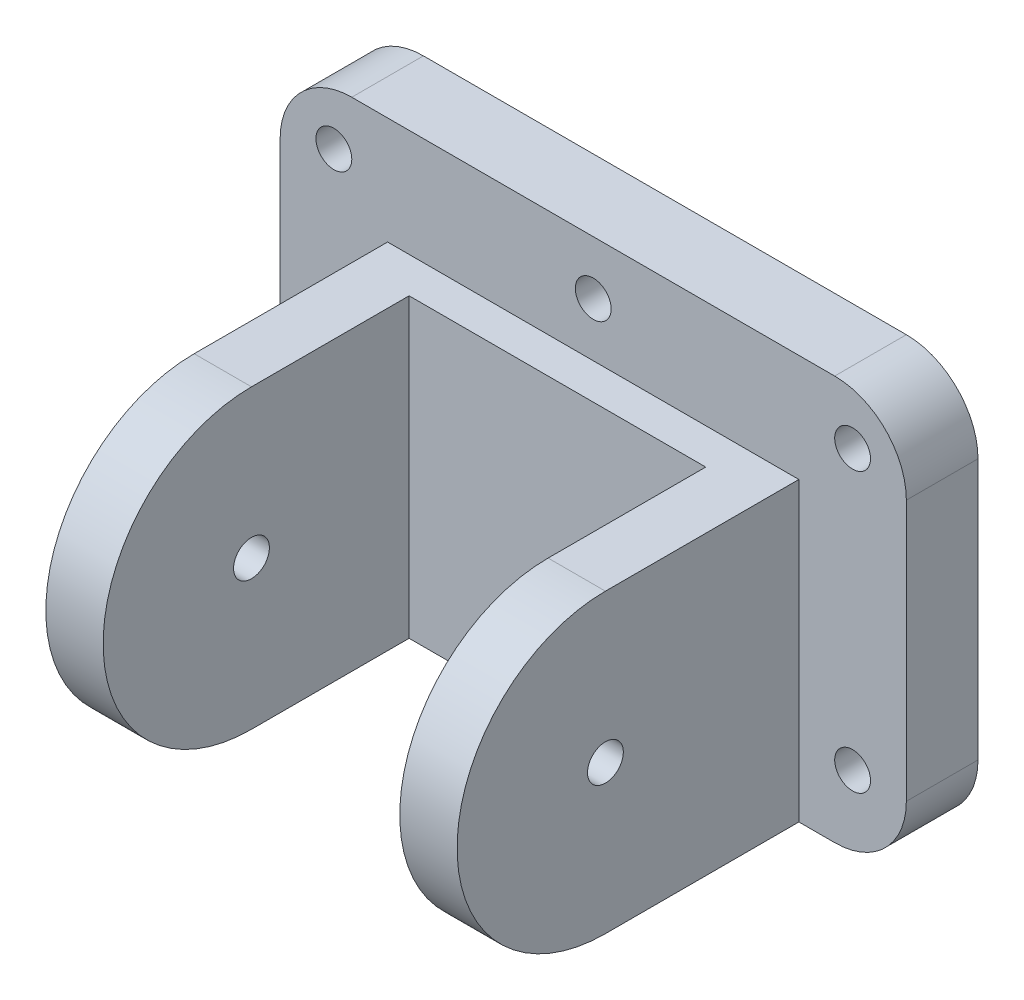
ISO-10303-21;
HEADER;
FILE_DESCRIPTION(('STEP AP214'),'2;1');
FILE_NAME('part.step','',(''),(''),'','','');
FILE_SCHEMA(('AUTOMOTIVE_DESIGN { 1 0 10303 214 1 1 1 1 }'));
ENDSEC;
DATA;
#1=APPLICATION_CONTEXT('core data for automotive mechanical design processes');
#2=APPLICATION_PROTOCOL_DEFINITION('international standard','automotive_design',2000,#1);
#3=PRODUCT_CONTEXT('',#1,'mechanical');
#4=PRODUCT('Part','Part','',(#3));
#5=PRODUCT_RELATED_PRODUCT_CATEGORY('part','',(#4));
#6=PRODUCT_DEFINITION_FORMATION('','',#4);
#7=PRODUCT_DEFINITION_CONTEXT('part definition',#1,'design');
#8=PRODUCT_DEFINITION('design','',#6,#7);
#9=PRODUCT_DEFINITION_SHAPE('','',#8);
#10=(LENGTH_UNIT() NAMED_UNIT(*) SI_UNIT(.MILLI.,.METRE.));
#11=(NAMED_UNIT(*) PLANE_ANGLE_UNIT() SI_UNIT($,.RADIAN.));
#12=(NAMED_UNIT(*) SI_UNIT($,.STERADIAN.) SOLID_ANGLE_UNIT());
#13=UNCERTAINTY_MEASURE_WITH_UNIT(LENGTH_MEASURE(1.E-05),#10,'distance_accuracy_value','');
#14=(GEOMETRIC_REPRESENTATION_CONTEXT(3) GLOBAL_UNCERTAINTY_ASSIGNED_CONTEXT((#13)) GLOBAL_UNIT_ASSIGNED_CONTEXT((#10,
#11,#12)) REPRESENTATION_CONTEXT('',''));
#15=CARTESIAN_POINT('',(0.,0.,0.));
#16=DIRECTION('',(0.,0.,1.));
#17=DIRECTION('',(1.,0.,0.));
#18=AXIS2_PLACEMENT_3D('',#15,#16,#17);
#19=CARTESIAN_POINT('',(-28.7,20.7,10.));
#20=DIRECTION('',(0.,-1.,0.));
#21=DIRECTION('',(0.,0.,-1.));
#22=AXIS2_PLACEMENT_3D('',#19,#20,#21);
#23=PLANE('',#22);
#24=DIRECTION('',(1.,0.,0.));
#25=VECTOR('',#24,1.);
#26=CARTESIAN_POINT('',(-43.7,20.7,10.));
#27=LINE('',#26,#25);
#28=CARTESIAN_POINT('',(-28.7,20.7,10.));
#29=VERTEX_POINT('',#28);
#30=CARTESIAN_POINT('',(28.7,20.7,10.));
#31=VERTEX_POINT('',#30);
#32=EDGE_CURVE('E147',#29,#31,#27,.T.);
#33=ORIENTED_EDGE('',*,*,#32,.F.);
#34=DIRECTION('',(0.,0.,-1.));
#35=VECTOR('',#34,1.);
#36=CARTESIAN_POINT('',(-28.7,20.7,10.));
#37=LINE('',#36,#35);
#38=CARTESIAN_POINT('',(-28.7,20.7,37.));
#39=VERTEX_POINT('',#38);
#40=EDGE_CURVE('E149',#39,#29,#37,.T.);
#41=ORIENTED_EDGE('',*,*,#40,.F.);
#42=DIRECTION('',(-1.,0.,0.));
#43=VECTOR('',#42,1.);
#44=CARTESIAN_POINT('',(-20.7,20.7,37.));
#45=LINE('',#44,#43);
#46=CARTESIAN_POINT('',(-20.7,20.7,37.));
#47=VERTEX_POINT('',#46);
#48=EDGE_CURVE('E208',#47,#39,#45,.T.);
#49=ORIENTED_EDGE('',*,*,#48,.F.);
#50=DIRECTION('',(0.,0.,-1.));
#51=VECTOR('',#50,1.);
#52=CARTESIAN_POINT('',(-20.7,20.7,15.));
#53=LINE('',#52,#51);
#54=CARTESIAN_POINT('',(-20.7,20.7,15.));
#55=VERTEX_POINT('',#54);
#56=EDGE_CURVE('E194',#47,#55,#53,.T.);
#57=ORIENTED_EDGE('',*,*,#56,.T.);
#58=DIRECTION('',(-1.,0.,0.));
#59=VECTOR('',#58,1.);
#60=CARTESIAN_POINT('',(-28.7,20.7,15.));
#61=LINE('',#60,#59);
#62=CARTESIAN_POINT('',(20.7,20.7,15.));
#63=VERTEX_POINT('',#62);
#64=EDGE_CURVE('E231',#63,#55,#61,.T.);
#65=ORIENTED_EDGE('',*,*,#64,.F.);
#66=DIRECTION('',(0.,0.,1.));
#67=VECTOR('',#66,1.);
#68=CARTESIAN_POINT('',(20.7,20.7,15.));
#69=LINE('',#68,#67);
#70=CARTESIAN_POINT('',(20.7,20.7,37.));
#71=VERTEX_POINT('',#70);
#72=EDGE_CURVE('E219',#63,#71,#69,.T.);
#73=ORIENTED_EDGE('',*,*,#72,.T.);
#74=DIRECTION('',(1.,0.,0.));
#75=VECTOR('',#74,1.);
#76=CARTESIAN_POINT('',(20.7,20.7,37.));
#77=LINE('',#76,#75);
#78=CARTESIAN_POINT('',(28.7,20.7,37.));
#79=VERTEX_POINT('',#78);
#80=EDGE_CURVE('E225',#71,#79,#77,.T.);
#81=ORIENTED_EDGE('',*,*,#80,.T.);
#82=DIRECTION('',(0.,0.,-1.));
#83=VECTOR('',#82,1.);
#84=CARTESIAN_POINT('',(28.7,20.7,10.));
#85=LINE('',#84,#83);
#86=EDGE_CURVE('E152',#79,#31,#85,.T.);
#87=ORIENTED_EDGE('',*,*,#86,.T.);
#88=EDGE_LOOP('',(#33,#41,#49,#57,#65,#73,#81,#87));
#89=FACE_BOUND('',#88,.T.);
#90=ADVANCED_FACE('F33',(#89),#23,.F.);
#91=CARTESIAN_POINT('',(28.7,20.7,10.));
#92=DIRECTION('',(-1.,0.,0.));
#93=DIRECTION('',(0.,0.,1.));
#94=AXIS2_PLACEMENT_3D('',#91,#92,#93);
#95=PLANE('',#94);
#96=CARTESIAN_POINT('',(28.7,0.,37.));
#97=DIRECTION('',(1.,0.,0.));
#98=DIRECTION('',(0.,0.,-1.));
#99=AXIS2_PLACEMENT_3D('',#96,#97,#98);
#100=CIRCLE('',#99,2.5);
#101=CARTESIAN_POINT('',(28.7,0.,34.5));
#102=VERTEX_POINT('',#101);
#103=EDGE_CURVE('E184',#102,#102,#100,.T.);
#104=ORIENTED_EDGE('',*,*,#103,.F.);
#105=EDGE_LOOP('',(#104));
#106=FACE_BOUND('',#105,.T.);
#107=DIRECTION('',(0.,-1.,0.));
#108=VECTOR('',#107,1.);
#109=CARTESIAN_POINT('',(28.7,20.7,10.));
#110=LINE('',#109,#108);
#111=CARTESIAN_POINT('',(28.7,-20.7,9.99999999999999));
#112=VERTEX_POINT('',#111);
#113=EDGE_CURVE('E289',#31,#112,#110,.T.);
#114=ORIENTED_EDGE('',*,*,#113,.F.);
#115=ORIENTED_EDGE('',*,*,#86,.F.);
#116=CARTESIAN_POINT('',(28.7,0.,37.));
#117=DIRECTION('',(1.,0.,0.));
#118=DIRECTION('',(0.,0.,1.));
#119=AXIS2_PLACEMENT_3D('',#116,#117,#118);
#120=CIRCLE('',#119,20.7);
#121=CARTESIAN_POINT('',(28.7,-20.7,37.));
#122=VERTEX_POINT('',#121);
#123=EDGE_CURVE('E210',#79,#122,#120,.T.);
#124=ORIENTED_EDGE('',*,*,#123,.T.);
#125=DIRECTION('',(0.,0.,-1.));
#126=VECTOR('',#125,1.);
#127=CARTESIAN_POINT('',(28.7,-20.7,10.));
#128=LINE('',#127,#126);
#129=EDGE_CURVE('E239',#122,#112,#128,.T.);
#130=ORIENTED_EDGE('',*,*,#129,.T.);
#131=EDGE_LOOP('',(#114,#115,#124,#130));
#132=FACE_BOUND('',#131,.T.);
#133=ADVANCED_FACE('F322',(#106,#132),#95,.F.);
#134=CARTESIAN_POINT('',(-28.7,20.7,10.));
#135=DIRECTION('',(1.,0.,0.));
#136=DIRECTION('',(0.,0.,-1.));
#137=AXIS2_PLACEMENT_3D('',#134,#135,#136);
#138=PLANE('',#137);
#139=CARTESIAN_POINT('',(-28.7,0.,37.));
#140=DIRECTION('',(1.,0.,0.));
#141=DIRECTION('',(0.,0.,-1.));
#142=AXIS2_PLACEMENT_3D('',#139,#140,#141);
#143=CIRCLE('',#142,2.5);
#144=CARTESIAN_POINT('',(-28.7,0.,34.5));
#145=VERTEX_POINT('',#144);
#146=EDGE_CURVE('E187',#145,#145,#143,.F.);
#147=ORIENTED_EDGE('',*,*,#146,.F.);
#148=EDGE_LOOP('',(#147));
#149=FACE_BOUND('',#148,.T.);
#150=DIRECTION('',(0.,1.,0.));
#151=VECTOR('',#150,1.);
#152=CARTESIAN_POINT('',(-28.7,20.7,10.));
#153=LINE('',#152,#151);
#154=CARTESIAN_POINT('',(-28.7,-20.7,10.));
#155=VERTEX_POINT('',#154);
#156=EDGE_CURVE('E163',#155,#29,#153,.T.);
#157=ORIENTED_EDGE('',*,*,#156,.F.);
#158=DIRECTION('',(0.,0.,-1.));
#159=VECTOR('',#158,1.);
#160=CARTESIAN_POINT('',(-28.7,-20.7,10.));
#161=LINE('',#160,#159);
#162=CARTESIAN_POINT('',(-28.7,-20.7,37.));
#163=VERTEX_POINT('',#162);
#164=EDGE_CURVE('E167',#163,#155,#161,.T.);
#165=ORIENTED_EDGE('',*,*,#164,.F.);
#166=CARTESIAN_POINT('',(-28.7,0.,37.));
#167=DIRECTION('',(-1.,0.,0.));
#168=DIRECTION('',(0.,0.,-1.));
#169=AXIS2_PLACEMENT_3D('',#166,#167,#168);
#170=CIRCLE('',#169,20.7);
#171=EDGE_CURVE('E166',#163,#39,#170,.T.);
#172=ORIENTED_EDGE('',*,*,#171,.T.);
#173=ORIENTED_EDGE('',*,*,#40,.T.);
#174=EDGE_LOOP('',(#157,#165,#172,#173));
#175=FACE_BOUND('',#174,.T.);
#176=ADVANCED_FACE('F162',(#149,#175),#138,.F.);
#177=CARTESIAN_POINT('',(0.,0.,15.));
#178=DIRECTION('',(0.,0.,1.));
#179=DIRECTION('',(1.,0.,0.));
#180=AXIS2_PLACEMENT_3D('',#177,#178,#179);
#181=PLANE('',#180);
#182=DIRECTION('',(0.,-1.,0.));
#183=VECTOR('',#182,1.);
#184=CARTESIAN_POINT('',(-20.7,20.7,15.));
#185=LINE('',#184,#183);
#186=CARTESIAN_POINT('',(-20.7,-20.7,15.));
#187=VERTEX_POINT('',#186);
#188=EDGE_CURVE('E197',#55,#187,#185,.T.);
#189=ORIENTED_EDGE('',*,*,#188,.T.);
#190=DIRECTION('',(1.,0.,0.));
#191=VECTOR('',#190,1.);
#192=CARTESIAN_POINT('',(-28.7,-20.7,15.));
#193=LINE('',#192,#191);
#194=CARTESIAN_POINT('',(20.7,-20.7,15.));
#195=VERTEX_POINT('',#194);
#196=EDGE_CURVE('E234',#187,#195,#193,.T.);
#197=ORIENTED_EDGE('',*,*,#196,.T.);
#198=DIRECTION('',(0.,1.,0.));
#199=VECTOR('',#198,1.);
#200=CARTESIAN_POINT('',(20.7,-20.7,15.));
#201=LINE('',#200,#199);
#202=EDGE_CURVE('E216',#195,#63,#201,.T.);
#203=ORIENTED_EDGE('',*,*,#202,.T.);
#204=ORIENTED_EDGE('',*,*,#64,.T.);
#205=EDGE_LOOP('',(#189,#197,#203,#204));
#206=FACE_BOUND('',#205,.T.);
#207=ADVANCED_FACE('F465',(#206),#181,.T.);
#208=CARTESIAN_POINT('',(-28.7,-20.7,10.));
#209=DIRECTION('',(0.,1.,0.));
#210=DIRECTION('',(0.,0.,1.));
#211=AXIS2_PLACEMENT_3D('',#208,#209,#210);
#212=PLANE('',#211);
#213=DIRECTION('',(1.,0.,0.));
#214=VECTOR('',#213,1.);
#215=CARTESIAN_POINT('',(-28.7,-20.7,0.));
#216=LINE('',#215,#214);
#217=CARTESIAN_POINT('',(-33.7,-20.7,0.));
#218=VERTEX_POINT('',#217);
#219=CARTESIAN_POINT('',(33.7,-20.7,0.));
#220=VERTEX_POINT('',#219);
#221=EDGE_CURVE('E236',#218,#220,#216,.T.);
#222=ORIENTED_EDGE('',*,*,#221,.T.);
#223=DIRECTION('',(0.,0.,-1.));
#224=VECTOR('',#223,1.);
#225=CARTESIAN_POINT('',(33.7,-20.7,10.));
#226=LINE('',#225,#224);
#227=CARTESIAN_POINT('',(33.7,-20.7,9.99999999999999));
#228=VERTEX_POINT('',#227);
#229=EDGE_CURVE('E261',#220,#228,#226,.F.);
#230=ORIENTED_EDGE('',*,*,#229,.T.);
#231=DIRECTION('',(-1.,0.,0.));
#232=VECTOR('',#231,1.);
#233=CARTESIAN_POINT('',(43.7,-20.7,9.99999999999999));
#234=LINE('',#233,#232);
#235=EDGE_CURVE('E174',#228,#112,#234,.T.);
#236=ORIENTED_EDGE('',*,*,#235,.T.);
#237=ORIENTED_EDGE('',*,*,#129,.F.);
#238=DIRECTION('',(1.,0.,0.));
#239=VECTOR('',#238,1.);
#240=CARTESIAN_POINT('',(20.7,-20.7,37.));
#241=LINE('',#240,#239);
#242=CARTESIAN_POINT('',(20.7,-20.7,37.));
#243=VERTEX_POINT('',#242);
#244=EDGE_CURVE('E228',#243,#122,#241,.T.);
#245=ORIENTED_EDGE('',*,*,#244,.F.);
#246=DIRECTION('',(0.,0.,-1.));
#247=VECTOR('',#246,1.);
#248=CARTESIAN_POINT('',(20.7,-20.7,15.));
#249=LINE('',#248,#247);
#250=EDGE_CURVE('E213',#243,#195,#249,.T.);
#251=ORIENTED_EDGE('',*,*,#250,.T.);
#252=ORIENTED_EDGE('',*,*,#196,.F.);
#253=DIRECTION('',(0.,0.,1.));
#254=VECTOR('',#253,1.);
#255=CARTESIAN_POINT('',(-20.7,-20.7,15.));
#256=LINE('',#255,#254);
#257=CARTESIAN_POINT('',(-20.7,-20.7,37.));
#258=VERTEX_POINT('',#257);
#259=EDGE_CURVE('E200',#187,#258,#256,.T.);
#260=ORIENTED_EDGE('',*,*,#259,.T.);
#261=DIRECTION('',(-1.,0.,0.));
#262=VECTOR('',#261,1.);
#263=CARTESIAN_POINT('',(-20.7,-20.7,37.));
#264=LINE('',#263,#262);
#265=EDGE_CURVE('E206',#258,#163,#264,.T.);
#266=ORIENTED_EDGE('',*,*,#265,.T.);
#267=ORIENTED_EDGE('',*,*,#164,.T.);
#268=DIRECTION('',(1.,0.,0.));
#269=VECTOR('',#268,1.);
#270=CARTESIAN_POINT('',(-43.7,-20.7,10.));
#271=LINE('',#270,#269);
#272=CARTESIAN_POINT('',(-33.7,-20.7,10.));
#273=VERTEX_POINT('',#272);
#274=EDGE_CURVE('E172',#273,#155,#271,.T.);
#275=ORIENTED_EDGE('',*,*,#274,.F.);
#276=DIRECTION('',(0.,0.,1.));
#277=VECTOR('',#276,1.);
#278=CARTESIAN_POINT('',(-33.7,-20.7,0.));
#279=LINE('',#278,#277);
#280=EDGE_CURVE('E259',#273,#218,#279,.F.);
#281=ORIENTED_EDGE('',*,*,#280,.T.);
#282=EDGE_LOOP('',(#222,#230,#236,#237,#245,#251,#252,#260,#266,#267,#275,#281));
#283=FACE_BOUND('',#282,.T.);
#284=ADVANCED_FACE('F310',(#283),#212,.F.);
#285=CARTESIAN_POINT('',(0.,0.,0.));
#286=DIRECTION('',(0.,0.,1.));
#287=DIRECTION('',(1.,0.,0.));
#288=AXIS2_PLACEMENT_3D('',#285,#286,#287);
#289=PLANE('',#288);
#290=CARTESIAN_POINT('',(-36.2,28.2,0.));
#291=DIRECTION('',(0.,0.,1.));
#292=DIRECTION('',(1.,0.,0.));
#293=AXIS2_PLACEMENT_3D('',#290,#291,#292);
#294=CIRCLE('',#293,2.5);
#295=CARTESIAN_POINT('',(-33.7,28.2,0.));
#296=VERTEX_POINT('',#295);
#297=EDGE_CURVE('E627',#296,#296,#294,.F.);
#298=ORIENTED_EDGE('',*,*,#297,.F.);
#299=EDGE_LOOP('',(#298));
#300=FACE_BOUND('',#299,.T.);
#301=CARTESIAN_POINT('',(36.2,28.2,0.));
#302=DIRECTION('',(0.,0.,1.));
#303=DIRECTION('',(1.,0.,0.));
#304=AXIS2_PLACEMENT_3D('',#301,#302,#303);
#305=CIRCLE('',#304,2.5);
#306=CARTESIAN_POINT('',(38.7,28.2,0.));
#307=VERTEX_POINT('',#306);
#308=EDGE_CURVE('E631',#307,#307,#305,.F.);
#309=ORIENTED_EDGE('',*,*,#308,.F.);
#310=EDGE_LOOP('',(#309));
#311=FACE_BOUND('',#310,.T.);
#312=CARTESIAN_POINT('',(36.2,-10.7,0.));
#313=DIRECTION('',(0.,0.,1.));
#314=DIRECTION('',(1.,0.,0.));
#315=AXIS2_PLACEMENT_3D('',#312,#313,#314);
#316=CIRCLE('',#315,2.5);
#317=CARTESIAN_POINT('',(38.7,-10.7,0.));
#318=VERTEX_POINT('',#317);
#319=EDGE_CURVE('E635',#318,#318,#316,.F.);
#320=ORIENTED_EDGE('',*,*,#319,.F.);
#321=EDGE_LOOP('',(#320));
#322=FACE_BOUND('',#321,.T.);
#323=CARTESIAN_POINT('',(0.,28.2,0.));
#324=DIRECTION('',(0.,0.,1.));
#325=DIRECTION('',(1.,0.,0.));
#326=AXIS2_PLACEMENT_3D('',#323,#324,#325);
#327=CIRCLE('',#326,2.5);
#328=CARTESIAN_POINT('',(2.5,28.2,0.));
#329=VERTEX_POINT('',#328);
#330=EDGE_CURVE('E639',#329,#329,#327,.F.);
#331=ORIENTED_EDGE('',*,*,#330,.F.);
#332=EDGE_LOOP('',(#331));
#333=FACE_BOUND('',#332,.T.);
#334=CARTESIAN_POINT('',(-36.2,-10.7,0.));
#335=DIRECTION('',(0.,0.,1.));
#336=DIRECTION('',(1.,0.,0.));
#337=AXIS2_PLACEMENT_3D('',#334,#335,#336);
#338=CIRCLE('',#337,2.5);
#339=CARTESIAN_POINT('',(-33.7,-10.7,0.));
#340=VERTEX_POINT('',#339);
#341=EDGE_CURVE('E157',#340,#340,#338,.F.);
#342=ORIENTED_EDGE('',*,*,#341,.F.);
#343=EDGE_LOOP('',(#342));
#344=FACE_BOUND('',#343,.T.);
#345=DIRECTION('',(0.,1.,0.));
#346=VECTOR('',#345,1.);
#347=CARTESIAN_POINT('',(43.7,20.7,0.));
#348=LINE('',#347,#346);
#349=CARTESIAN_POINT('',(43.7,-10.7,0.));
#350=VERTEX_POINT('',#349);
#351=CARTESIAN_POINT('',(43.7,25.7,0.));
#352=VERTEX_POINT('',#351);
#353=EDGE_CURVE('E291',#350,#352,#348,.T.);
#354=ORIENTED_EDGE('',*,*,#353,.F.);
#355=CARTESIAN_POINT('',(33.7,-10.7,0.));
#356=DIRECTION('',(0.,0.,1.));
#357=DIRECTION('',(1.,0.,0.));
#358=AXIS2_PLACEMENT_3D('',#355,#356,#357);
#359=CIRCLE('',#358,10.);
#360=EDGE_CURVE('E257',#350,#220,#359,.F.);
#361=ORIENTED_EDGE('',*,*,#360,.T.);
#362=ORIENTED_EDGE('',*,*,#221,.F.);
#363=CARTESIAN_POINT('',(-33.7,-10.7,0.));
#364=DIRECTION('',(0.,0.,1.));
#365=DIRECTION('',(1.,0.,0.));
#366=AXIS2_PLACEMENT_3D('',#363,#364,#365);
#367=CIRCLE('',#366,10.);
#368=CARTESIAN_POINT('',(-43.7,-10.7,0.));
#369=VERTEX_POINT('',#368);
#370=EDGE_CURVE('E255',#218,#369,#367,.F.);
#371=ORIENTED_EDGE('',*,*,#370,.T.);
#372=DIRECTION('',(0.,-1.,0.));
#373=VECTOR('',#372,1.);
#374=CARTESIAN_POINT('',(-43.7,20.7,0.));
#375=LINE('',#374,#373);
#376=CARTESIAN_POINT('',(-43.7,25.7,0.));
#377=VERTEX_POINT('',#376);
#378=EDGE_CURVE('E173',#377,#369,#375,.T.);
#379=ORIENTED_EDGE('',*,*,#378,.F.);
#380=CARTESIAN_POINT('',(-33.7,25.7,0.));
#381=DIRECTION('',(0.,0.,1.));
#382=DIRECTION('',(1.,0.,0.));
#383=AXIS2_PLACEMENT_3D('',#380,#381,#382);
#384=CIRCLE('',#383,10.);
#385=CARTESIAN_POINT('',(-33.7,35.7,0.));
#386=VERTEX_POINT('',#385);
#387=EDGE_CURVE('E253',#377,#386,#384,.F.);
#388=ORIENTED_EDGE('',*,*,#387,.T.);
#389=DIRECTION('',(-1.,0.,0.));
#390=VECTOR('',#389,1.);
#391=CARTESIAN_POINT('',(-43.7,35.7,0.));
#392=LINE('',#391,#390);
#393=CARTESIAN_POINT('',(33.7,35.7,0.));
#394=VERTEX_POINT('',#393);
#395=EDGE_CURVE('E279',#394,#386,#392,.T.);
#396=ORIENTED_EDGE('',*,*,#395,.F.);
#397=CARTESIAN_POINT('',(33.7,25.7,0.));
#398=DIRECTION('',(0.,0.,1.));
#399=DIRECTION('',(1.,0.,0.));
#400=AXIS2_PLACEMENT_3D('',#397,#398,#399);
#401=CIRCLE('',#400,10.);
#402=EDGE_CURVE('E251',#394,#352,#401,.F.);
#403=ORIENTED_EDGE('',*,*,#402,.T.);
#404=EDGE_LOOP('',(#354,#361,#362,#371,#379,#388,#396,#403));
#405=FACE_BOUND('',#404,.T.);
#406=ADVANCED_FACE('F285',(#300,#311,#322,#333,#344,#405),#289,.F.);
#407=CARTESIAN_POINT('',(20.7,0.,37.));
#408=DIRECTION('',(1.,0.,0.));
#409=DIRECTION('',(0.,0.,-1.));
#410=AXIS2_PLACEMENT_3D('',#407,#408,#409);
#411=CYLINDRICAL_SURFACE('',#410,20.7);
#412=ORIENTED_EDGE('',*,*,#123,.F.);
#413=ORIENTED_EDGE('',*,*,#80,.F.);
#414=CARTESIAN_POINT('',(20.7,0.,37.));
#415=DIRECTION('',(1.,0.,0.));
#416=DIRECTION('',(0.,0.,1.));
#417=AXIS2_PLACEMENT_3D('',#414,#415,#416);
#418=CIRCLE('',#417,20.7);
#419=EDGE_CURVE('E222',#71,#243,#418,.T.);
#420=ORIENTED_EDGE('',*,*,#419,.T.);
#421=ORIENTED_EDGE('',*,*,#244,.T.);
#422=EDGE_LOOP('',(#412,#413,#420,#421));
#423=FACE_BOUND('',#422,.T.);
#424=ADVANCED_FACE('F453',(#423),#411,.T.);
#425=CARTESIAN_POINT('',(20.7,0.,37.));
#426=DIRECTION('',(-1.,0.,0.));
#427=DIRECTION('',(0.,0.,1.));
#428=AXIS2_PLACEMENT_3D('',#425,#426,#427);
#429=PLANE('',#428);
#430=CARTESIAN_POINT('',(20.7,0.,37.));
#431=DIRECTION('',(-1.,0.,0.));
#432=DIRECTION('',(0.,0.,1.));
#433=AXIS2_PLACEMENT_3D('',#430,#431,#432);
#434=CIRCLE('',#433,2.5);
#435=CARTESIAN_POINT('',(20.7,0.,39.5));
#436=VERTEX_POINT('',#435);
#437=EDGE_CURVE('E191',#436,#436,#434,.T.);
#438=ORIENTED_EDGE('',*,*,#437,.F.);
#439=EDGE_LOOP('',(#438));
#440=FACE_BOUND('',#439,.T.);
#441=ORIENTED_EDGE('',*,*,#250,.F.);
#442=ORIENTED_EDGE('',*,*,#419,.F.);
#443=ORIENTED_EDGE('',*,*,#72,.F.);
#444=ORIENTED_EDGE('',*,*,#202,.F.);
#445=EDGE_LOOP('',(#441,#442,#443,#444));
#446=FACE_BOUND('',#445,.T.);
#447=ADVANCED_FACE('F528',(#440,#446),#429,.T.);
#448=CARTESIAN_POINT('',(-20.7,0.,37.));
#449=DIRECTION('',(-1.,0.,0.));
#450=DIRECTION('',(0.,0.,1.));
#451=AXIS2_PLACEMENT_3D('',#448,#449,#450);
#452=CYLINDRICAL_SURFACE('',#451,20.7);
#453=ORIENTED_EDGE('',*,*,#171,.F.);
#454=ORIENTED_EDGE('',*,*,#265,.F.);
#455=CARTESIAN_POINT('',(-20.7,0.,37.));
#456=DIRECTION('',(-1.,0.,0.));
#457=DIRECTION('',(0.,0.,-1.));
#458=AXIS2_PLACEMENT_3D('',#455,#456,#457);
#459=CIRCLE('',#458,20.7);
#460=EDGE_CURVE('E203',#258,#47,#459,.T.);
#461=ORIENTED_EDGE('',*,*,#460,.T.);
#462=ORIENTED_EDGE('',*,*,#48,.T.);
#463=EDGE_LOOP('',(#453,#454,#461,#462));
#464=FACE_BOUND('',#463,.T.);
#465=ADVANCED_FACE('F520',(#464),#452,.T.);
#466=CARTESIAN_POINT('',(-20.7,0.,37.));
#467=DIRECTION('',(1.,0.,0.));
#468=DIRECTION('',(0.,0.,-1.));
#469=AXIS2_PLACEMENT_3D('',#466,#467,#468);
#470=PLANE('',#469);
#471=CARTESIAN_POINT('',(-20.7,0.,37.));
#472=DIRECTION('',(1.,0.,0.));
#473=DIRECTION('',(0.,0.,-1.));
#474=AXIS2_PLACEMENT_3D('',#471,#472,#473);
#475=CIRCLE('',#474,2.5);
#476=CARTESIAN_POINT('',(-20.7,0.,34.5));
#477=VERTEX_POINT('',#476);
#478=EDGE_CURVE('E190',#477,#477,#475,.T.);
#479=ORIENTED_EDGE('',*,*,#478,.F.);
#480=EDGE_LOOP('',(#479));
#481=FACE_BOUND('',#480,.T.);
#482=ORIENTED_EDGE('',*,*,#56,.F.);
#483=ORIENTED_EDGE('',*,*,#460,.F.);
#484=ORIENTED_EDGE('',*,*,#259,.F.);
#485=ORIENTED_EDGE('',*,*,#188,.F.);
#486=EDGE_LOOP('',(#482,#483,#484,#485));
#487=FACE_BOUND('',#486,.T.);
#488=ADVANCED_FACE('F511',(#481,#487),#470,.T.);
#489=CARTESIAN_POINT('',(-35.7710678118655,0.,37.));
#490=DIRECTION('',(1.,0.,0.));
#491=DIRECTION('',(0.,0.,-1.));
#492=AXIS2_PLACEMENT_3D('',#489,#490,#491);
#493=CYLINDRICAL_SURFACE('',#492,2.5);
#494=ORIENTED_EDGE('',*,*,#478,.T.);
#495=EDGE_LOOP('',(#494));
#496=FACE_BOUND('',#495,.T.);
#497=ORIENTED_EDGE('',*,*,#146,.T.);
#498=EDGE_LOOP('',(#497));
#499=FACE_BOUND('',#498,.T.);
#500=ADVANCED_FACE('F500',(#496,#499),#493,.F.);
#501=ORIENTED_EDGE('',*,*,#437,.T.);
#502=EDGE_LOOP('',(#501));
#503=FACE_BOUND('',#502,.T.);
#504=ORIENTED_EDGE('',*,*,#103,.T.);
#505=EDGE_LOOP('',(#504));
#506=FACE_BOUND('',#505,.T.);
#507=ADVANCED_FACE('F442',(#503,#506),#493,.F.);
#508=CARTESIAN_POINT('',(-43.7,20.7,10.));
#509=DIRECTION('',(0.,0.,-1.));
#510=DIRECTION('',(0.,1.,0.));
#511=AXIS2_PLACEMENT_3D('',#508,#509,#510);
#512=PLANE('',#511);
#513=CARTESIAN_POINT('',(-36.2,28.2,10.));
#514=DIRECTION('',(0.,0.,1.));
#515=DIRECTION('',(1.,0.,0.));
#516=AXIS2_PLACEMENT_3D('',#513,#514,#515);
#517=CIRCLE('',#516,2.5);
#518=CARTESIAN_POINT('',(-33.7,28.2,10.));
#519=VERTEX_POINT('',#518);
#520=EDGE_CURVE('E647',#519,#519,#517,.T.);
#521=ORIENTED_EDGE('',*,*,#520,.F.);
#522=EDGE_LOOP('',(#521));
#523=FACE_BOUND('',#522,.T.);
#524=CARTESIAN_POINT('',(36.2,28.2,10.));
#525=DIRECTION('',(0.,0.,1.));
#526=DIRECTION('',(1.,0.,0.));
#527=AXIS2_PLACEMENT_3D('',#524,#525,#526);
#528=CIRCLE('',#527,2.5);
#529=CARTESIAN_POINT('',(38.7,28.2,10.));
#530=VERTEX_POINT('',#529);
#531=EDGE_CURVE('E648',#530,#530,#528,.T.);
#532=ORIENTED_EDGE('',*,*,#531,.F.);
#533=EDGE_LOOP('',(#532));
#534=FACE_BOUND('',#533,.T.);
#535=CARTESIAN_POINT('',(36.2,-10.7,10.));
#536=DIRECTION('',(0.,0.,1.));
#537=DIRECTION('',(1.,0.,0.));
#538=AXIS2_PLACEMENT_3D('',#535,#536,#537);
#539=CIRCLE('',#538,2.5);
#540=CARTESIAN_POINT('',(38.7,-10.7,10.));
#541=VERTEX_POINT('',#540);
#542=EDGE_CURVE('E655',#541,#541,#539,.T.);
#543=ORIENTED_EDGE('',*,*,#542,.F.);
#544=EDGE_LOOP('',(#543));
#545=FACE_BOUND('',#544,.T.);
#546=CARTESIAN_POINT('',(0.,28.2,10.));
#547=DIRECTION('',(0.,0.,1.));
#548=DIRECTION('',(1.,0.,0.));
#549=AXIS2_PLACEMENT_3D('',#546,#547,#548);
#550=CIRCLE('',#549,2.5);
#551=CARTESIAN_POINT('',(2.5,28.2,10.));
#552=VERTEX_POINT('',#551);
#553=EDGE_CURVE('E656',#552,#552,#550,.T.);
#554=ORIENTED_EDGE('',*,*,#553,.F.);
#555=EDGE_LOOP('',(#554));
#556=FACE_BOUND('',#555,.T.);
#557=CARTESIAN_POINT('',(-36.2,-10.7,10.));
#558=DIRECTION('',(0.,0.,1.));
#559=DIRECTION('',(1.,0.,0.));
#560=AXIS2_PLACEMENT_3D('',#557,#558,#559);
#561=CIRCLE('',#560,2.5);
#562=CARTESIAN_POINT('',(-33.7,-10.7,10.));
#563=VERTEX_POINT('',#562);
#564=EDGE_CURVE('E642',#563,#563,#561,.T.);
#565=ORIENTED_EDGE('',*,*,#564,.F.);
#566=EDGE_LOOP('',(#565));
#567=FACE_BOUND('',#566,.T.);
#568=ORIENTED_EDGE('',*,*,#235,.F.);
#569=CARTESIAN_POINT('',(33.7,-10.7,10.));
#570=DIRECTION('',(0.,0.,-1.));
#571=DIRECTION('',(0.,1.,0.));
#572=AXIS2_PLACEMENT_3D('',#569,#570,#571);
#573=CIRCLE('',#572,10.);
#574=CARTESIAN_POINT('',(43.7,-10.7,10.));
#575=VERTEX_POINT('',#574);
#576=EDGE_CURVE('E267',#228,#575,#573,.F.);
#577=ORIENTED_EDGE('',*,*,#576,.T.);
#578=DIRECTION('',(0.,-1.,0.));
#579=VECTOR('',#578,1.);
#580=CARTESIAN_POINT('',(43.7,20.7,10.));
#581=LINE('',#580,#579);
#582=CARTESIAN_POINT('',(43.7,25.7,10.));
#583=VERTEX_POINT('',#582);
#584=EDGE_CURVE('E179',#583,#575,#581,.T.);
#585=ORIENTED_EDGE('',*,*,#584,.F.);
#586=CARTESIAN_POINT('',(33.7,25.7,10.));
#587=DIRECTION('',(0.,0.,-1.));
#588=DIRECTION('',(0.,1.,0.));
#589=AXIS2_PLACEMENT_3D('',#586,#587,#588);
#590=CIRCLE('',#589,10.);
#591=CARTESIAN_POINT('',(33.7,35.7,10.));
#592=VERTEX_POINT('',#591);
#593=EDGE_CURVE('E263',#583,#592,#590,.F.);
#594=ORIENTED_EDGE('',*,*,#593,.T.);
#595=DIRECTION('',(1.,0.,0.));
#596=VECTOR('',#595,1.);
#597=CARTESIAN_POINT('',(-43.7,35.7,10.));
#598=LINE('',#597,#596);
#599=CARTESIAN_POINT('',(-33.7,35.7,10.));
#600=VERTEX_POINT('',#599);
#601=EDGE_CURVE('E156',#600,#592,#598,.T.);
#602=ORIENTED_EDGE('',*,*,#601,.F.);
#603=CARTESIAN_POINT('',(-33.7,25.7,10.));
#604=DIRECTION('',(0.,0.,-1.));
#605=DIRECTION('',(0.,1.,0.));
#606=AXIS2_PLACEMENT_3D('',#603,#604,#605);
#607=CIRCLE('',#606,10.);
#608=CARTESIAN_POINT('',(-43.7,25.7,10.));
#609=VERTEX_POINT('',#608);
#610=EDGE_CURVE('E48',#600,#609,#607,.F.);
#611=ORIENTED_EDGE('',*,*,#610,.T.);
#612=DIRECTION('',(0.,1.,0.));
#613=VECTOR('',#612,1.);
#614=CARTESIAN_POINT('',(-43.7,20.7,10.));
#615=LINE('',#614,#613);
#616=CARTESIAN_POINT('',(-43.7,-10.7,10.));
#617=VERTEX_POINT('',#616);
#618=EDGE_CURVE('E177',#617,#609,#615,.T.);
#619=ORIENTED_EDGE('',*,*,#618,.F.);
#620=CARTESIAN_POINT('',(-33.7,-10.7,10.));
#621=DIRECTION('',(0.,0.,-1.));
#622=DIRECTION('',(0.,1.,0.));
#623=AXIS2_PLACEMENT_3D('',#620,#621,#622);
#624=CIRCLE('',#623,10.);
#625=EDGE_CURVE('E56',#617,#273,#624,.F.);
#626=ORIENTED_EDGE('',*,*,#625,.T.);
#627=ORIENTED_EDGE('',*,*,#274,.T.);
#628=ORIENTED_EDGE('',*,*,#156,.T.);
#629=ORIENTED_EDGE('',*,*,#32,.T.);
#630=ORIENTED_EDGE('',*,*,#113,.T.);
#631=EDGE_LOOP('',(#568,#577,#585,#594,#602,#611,#619,#626,#627,#628,#629,#630));
#632=FACE_BOUND('',#631,.T.);
#633=ADVANCED_FACE('F170',(#523,#534,#545,#556,#567,#632),#512,.F.);
#634=CARTESIAN_POINT('',(-43.7,0.,0.));
#635=DIRECTION('',(-1.,0.,0.));
#636=DIRECTION('',(0.,0.,1.));
#637=AXIS2_PLACEMENT_3D('',#634,#635,#636);
#638=PLANE('',#637);
#639=ORIENTED_EDGE('',*,*,#378,.T.);
#640=DIRECTION('',(0.,0.,1.));
#641=VECTOR('',#640,1.);
#642=CARTESIAN_POINT('',(-43.7,-10.7,10.));
#643=LINE('',#642,#641);
#644=EDGE_CURVE('E271',#369,#617,#643,.T.);
#645=ORIENTED_EDGE('',*,*,#644,.T.);
#646=ORIENTED_EDGE('',*,*,#618,.T.);
#647=DIRECTION('',(0.,0.,1.));
#648=VECTOR('',#647,1.);
#649=CARTESIAN_POINT('',(-43.7,25.7,0.));
#650=LINE('',#649,#648);
#651=EDGE_CURVE('E269',#609,#377,#650,.F.);
#652=ORIENTED_EDGE('',*,*,#651,.T.);
#653=EDGE_LOOP('',(#639,#645,#646,#652));
#654=FACE_BOUND('',#653,.T.);
#655=ADVANCED_FACE('F313',(#654),#638,.T.);
#656=CARTESIAN_POINT('',(43.7,0.,0.));
#657=DIRECTION('',(-1.,0.,0.));
#658=DIRECTION('',(0.,0.,1.));
#659=AXIS2_PLACEMENT_3D('',#656,#657,#658);
#660=PLANE('',#659);
#661=ORIENTED_EDGE('',*,*,#584,.T.);
#662=DIRECTION('',(0.,0.,-1.));
#663=VECTOR('',#662,1.);
#664=CARTESIAN_POINT('',(43.7,-10.7,0.));
#665=LINE('',#664,#663);
#666=EDGE_CURVE('E248',#575,#350,#665,.T.);
#667=ORIENTED_EDGE('',*,*,#666,.T.);
#668=ORIENTED_EDGE('',*,*,#353,.T.);
#669=DIRECTION('',(0.,0.,-1.));
#670=VECTOR('',#669,1.);
#671=CARTESIAN_POINT('',(43.7,25.7,10.));
#672=LINE('',#671,#670);
#673=EDGE_CURVE('E244',#352,#583,#672,.F.);
#674=ORIENTED_EDGE('',*,*,#673,.T.);
#675=EDGE_LOOP('',(#661,#667,#668,#674));
#676=FACE_BOUND('',#675,.T.);
#677=ADVANCED_FACE('F301',(#676),#660,.F.);
#678=CARTESIAN_POINT('',(0.,35.7,0.));
#679=DIRECTION('',(0.,1.,0.));
#680=DIRECTION('',(0.,0.,1.));
#681=AXIS2_PLACEMENT_3D('',#678,#679,#680);
#682=PLANE('',#681);
#683=ORIENTED_EDGE('',*,*,#395,.T.);
#684=DIRECTION('',(0.,0.,1.));
#685=VECTOR('',#684,1.);
#686=CARTESIAN_POINT('',(-33.7,35.7,0.));
#687=LINE('',#686,#685);
#688=EDGE_CURVE('E11',#386,#600,#687,.T.);
#689=ORIENTED_EDGE('',*,*,#688,.T.);
#690=ORIENTED_EDGE('',*,*,#601,.T.);
#691=DIRECTION('',(0.,0.,-1.));
#692=VECTOR('',#691,1.);
#693=CARTESIAN_POINT('',(33.7,35.7,0.));
#694=LINE('',#693,#692);
#695=EDGE_CURVE('E41',#592,#394,#694,.T.);
#696=ORIENTED_EDGE('',*,*,#695,.T.);
#697=EDGE_LOOP('',(#683,#689,#690,#696));
#698=FACE_BOUND('',#697,.T.);
#699=ADVANCED_FACE('F278',(#698),#682,.T.);
#700=CARTESIAN_POINT('',(-36.2,-10.7,-7.07106781186548));
#701=DIRECTION('',(0.,0.,1.));
#702=DIRECTION('',(1.,0.,0.));
#703=AXIS2_PLACEMENT_3D('',#700,#701,#702);
#704=CYLINDRICAL_SURFACE('',#703,2.5);
#705=ORIENTED_EDGE('',*,*,#341,.T.);
#706=EDGE_LOOP('',(#705));
#707=FACE_BOUND('',#706,.T.);
#708=ORIENTED_EDGE('',*,*,#564,.T.);
#709=EDGE_LOOP('',(#708));
#710=FACE_BOUND('',#709,.T.);
#711=ADVANCED_FACE('F393',(#707,#710),#704,.F.);
#712=CARTESIAN_POINT('',(0.,28.2,-7.07106781186548));
#713=DIRECTION('',(0.,0.,1.));
#714=DIRECTION('',(1.,0.,0.));
#715=AXIS2_PLACEMENT_3D('',#712,#713,#714);
#716=CYLINDRICAL_SURFACE('',#715,2.5);
#717=ORIENTED_EDGE('',*,*,#330,.T.);
#718=EDGE_LOOP('',(#717));
#719=FACE_BOUND('',#718,.T.);
#720=ORIENTED_EDGE('',*,*,#553,.T.);
#721=EDGE_LOOP('',(#720));
#722=FACE_BOUND('',#721,.T.);
#723=ADVANCED_FACE('F384',(#719,#722),#716,.F.);
#724=CARTESIAN_POINT('',(36.2,-10.7,-7.07106781186548));
#725=DIRECTION('',(0.,0.,1.));
#726=DIRECTION('',(1.,0.,0.));
#727=AXIS2_PLACEMENT_3D('',#724,#725,#726);
#728=CYLINDRICAL_SURFACE('',#727,2.5);
#729=ORIENTED_EDGE('',*,*,#319,.T.);
#730=EDGE_LOOP('',(#729));
#731=FACE_BOUND('',#730,.T.);
#732=ORIENTED_EDGE('',*,*,#542,.T.);
#733=EDGE_LOOP('',(#732));
#734=FACE_BOUND('',#733,.T.);
#735=ADVANCED_FACE('F375',(#731,#734),#728,.F.);
#736=CARTESIAN_POINT('',(36.2,28.2,-7.07106781186548));
#737=DIRECTION('',(0.,0.,1.));
#738=DIRECTION('',(1.,0.,0.));
#739=AXIS2_PLACEMENT_3D('',#736,#737,#738);
#740=CYLINDRICAL_SURFACE('',#739,2.5);
#741=ORIENTED_EDGE('',*,*,#308,.T.);
#742=EDGE_LOOP('',(#741));
#743=FACE_BOUND('',#742,.T.);
#744=ORIENTED_EDGE('',*,*,#531,.T.);
#745=EDGE_LOOP('',(#744));
#746=FACE_BOUND('',#745,.T.);
#747=ADVANCED_FACE('F365',(#743,#746),#740,.F.);
#748=CARTESIAN_POINT('',(-36.2,28.2,-7.07106781186548));
#749=DIRECTION('',(0.,0.,1.));
#750=DIRECTION('',(1.,0.,0.));
#751=AXIS2_PLACEMENT_3D('',#748,#749,#750);
#752=CYLINDRICAL_SURFACE('',#751,2.5);
#753=ORIENTED_EDGE('',*,*,#297,.T.);
#754=EDGE_LOOP('',(#753));
#755=FACE_BOUND('',#754,.T.);
#756=ORIENTED_EDGE('',*,*,#520,.T.);
#757=EDGE_LOOP('',(#756));
#758=FACE_BOUND('',#757,.T.);
#759=ADVANCED_FACE('F334',(#755,#758),#752,.F.);
#760=CARTESIAN_POINT('',(33.7,-10.7,0.));
#761=DIRECTION('',(0.,0.,-1.));
#762=DIRECTION('',(-1.,0.,0.));
#763=AXIS2_PLACEMENT_3D('',#760,#761,#762);
#764=CYLINDRICAL_SURFACE('',#763,10.);
#765=ORIENTED_EDGE('',*,*,#576,.F.);
#766=ORIENTED_EDGE('',*,*,#229,.F.);
#767=ORIENTED_EDGE('',*,*,#360,.F.);
#768=ORIENTED_EDGE('',*,*,#666,.F.);
#769=EDGE_LOOP('',(#765,#766,#767,#768));
#770=FACE_BOUND('',#769,.T.);
#771=ADVANCED_FACE('F305',(#770),#764,.T.);
#772=CARTESIAN_POINT('',(-33.7,-10.7,0.));
#773=DIRECTION('',(0.,0.,-1.));
#774=DIRECTION('',(-1.,0.,0.));
#775=AXIS2_PLACEMENT_3D('',#772,#773,#774);
#776=CYLINDRICAL_SURFACE('',#775,10.);
#777=ORIENTED_EDGE('',*,*,#370,.F.);
#778=ORIENTED_EDGE('',*,*,#280,.F.);
#779=ORIENTED_EDGE('',*,*,#625,.F.);
#780=ORIENTED_EDGE('',*,*,#644,.F.);
#781=EDGE_LOOP('',(#777,#778,#779,#780));
#782=FACE_BOUND('',#781,.T.);
#783=ADVANCED_FACE('F311',(#782),#776,.T.);
#784=CARTESIAN_POINT('',(-33.7,25.7,0.));
#785=DIRECTION('',(0.,0.,1.));
#786=DIRECTION('',(1.,0.,0.));
#787=AXIS2_PLACEMENT_3D('',#784,#785,#786);
#788=CYLINDRICAL_SURFACE('',#787,10.);
#789=ORIENTED_EDGE('',*,*,#387,.F.);
#790=ORIENTED_EDGE('',*,*,#651,.F.);
#791=ORIENTED_EDGE('',*,*,#610,.F.);
#792=ORIENTED_EDGE('',*,*,#688,.F.);
#793=EDGE_LOOP('',(#789,#790,#791,#792));
#794=FACE_BOUND('',#793,.T.);
#795=ADVANCED_FACE('F316',(#794),#788,.T.);
#796=CARTESIAN_POINT('',(33.7,25.7,0.));
#797=DIRECTION('',(0.,0.,1.));
#798=DIRECTION('',(1.,0.,0.));
#799=AXIS2_PLACEMENT_3D('',#796,#797,#798);
#800=CYLINDRICAL_SURFACE('',#799,10.);
#801=ORIENTED_EDGE('',*,*,#593,.F.);
#802=ORIENTED_EDGE('',*,*,#673,.F.);
#803=ORIENTED_EDGE('',*,*,#402,.F.);
#804=ORIENTED_EDGE('',*,*,#695,.F.);
#805=EDGE_LOOP('',(#801,#802,#803,#804));
#806=FACE_BOUND('',#805,.T.);
#807=ADVANCED_FACE('F35',(#806),#800,.T.);
#808=CLOSED_SHELL('',(#90,#133,#176,#207,#284,#406,#424,#447,#465,#488,#500,#507,#633,#655,#677,
#699,#711,#723,#735,#747,#759,#771,#783,#795,#807));
#809=MANIFOLD_SOLID_BREP('B2',#808);
#810=ADVANCED_BREP_SHAPE_REPRESENTATION('',(#18,#809),#14);
#811=SHAPE_DEFINITION_REPRESENTATION(#9,#810);
ENDSEC;
END-ISO-10303-21;
